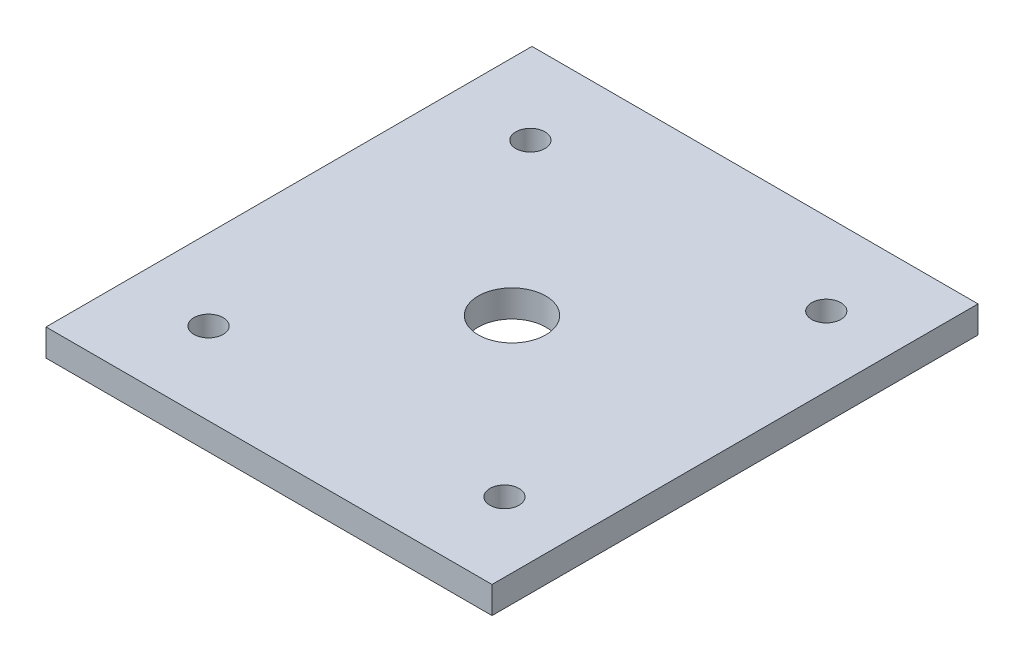
ISO-10303-21;
HEADER;
FILE_DESCRIPTION(('STEP AP214'),'2;1');
FILE_NAME('part.step','',(''),(''),'','','');
FILE_SCHEMA(('AUTOMOTIVE_DESIGN { 1 0 10303 214 1 1 1 1 }'));
ENDSEC;
DATA;
#1=APPLICATION_CONTEXT('core data for automotive mechanical design processes');
#2=APPLICATION_PROTOCOL_DEFINITION('international standard','automotive_design',2000,#1);
#3=PRODUCT_CONTEXT('',#1,'mechanical');
#4=PRODUCT('Part','Part','',(#3));
#5=PRODUCT_RELATED_PRODUCT_CATEGORY('part','',(#4));
#6=PRODUCT_DEFINITION_FORMATION('','',#4);
#7=PRODUCT_DEFINITION_CONTEXT('part definition',#1,'design');
#8=PRODUCT_DEFINITION('design','',#6,#7);
#9=PRODUCT_DEFINITION_SHAPE('','',#8);
#10=(LENGTH_UNIT() NAMED_UNIT(*) SI_UNIT(.MILLI.,.METRE.));
#11=(NAMED_UNIT(*) PLANE_ANGLE_UNIT() SI_UNIT($,.RADIAN.));
#12=(NAMED_UNIT(*) SI_UNIT($,.STERADIAN.) SOLID_ANGLE_UNIT());
#13=UNCERTAINTY_MEASURE_WITH_UNIT(LENGTH_MEASURE(1.E-05),#10,'distance_accuracy_value','');
#14=(GEOMETRIC_REPRESENTATION_CONTEXT(3) GLOBAL_UNCERTAINTY_ASSIGNED_CONTEXT((#13)) GLOBAL_UNIT_ASSIGNED_CONTEXT((#10,
#11,#12)) REPRESENTATION_CONTEXT('',''));
#15=CARTESIAN_POINT('',(0.,0.,0.));
#16=DIRECTION('',(0.,0.,1.));
#17=DIRECTION('',(1.,0.,0.));
#18=AXIS2_PLACEMENT_3D('',#15,#16,#17);
#19=CARTESIAN_POINT('',(52.451,6.35,-57.15));
#20=DIRECTION('',(-1.,0.,0.));
#21=DIRECTION('',(0.,0.,1.));
#22=AXIS2_PLACEMENT_3D('',#19,#20,#21);
#23=PLANE('',#22);
#24=DIRECTION('',(0.,0.,-1.));
#25=VECTOR('',#24,1.);
#26=CARTESIAN_POINT('',(52.451,0.,-57.15));
#27=LINE('',#26,#25);
#28=CARTESIAN_POINT('',(52.451,0.,57.15));
#29=VERTEX_POINT('',#28);
#30=CARTESIAN_POINT('',(52.451,0.,-57.15));
#31=VERTEX_POINT('',#30);
#32=EDGE_CURVE('E96',#29,#31,#27,.T.);
#33=ORIENTED_EDGE('',*,*,#32,.T.);
#34=DIRECTION('',(0.,-1.,0.));
#35=VECTOR('',#34,1.);
#36=CARTESIAN_POINT('',(52.451,6.35,-57.15));
#37=LINE('',#36,#35);
#38=CARTESIAN_POINT('',(52.451,6.35,-57.15));
#39=VERTEX_POINT('',#38);
#40=EDGE_CURVE('E11',#39,#31,#37,.T.);
#41=ORIENTED_EDGE('',*,*,#40,.F.);
#42=DIRECTION('',(0.,0.,-1.));
#43=VECTOR('',#42,1.);
#44=CARTESIAN_POINT('',(52.451,6.35,-57.15));
#45=LINE('',#44,#43);
#46=CARTESIAN_POINT('',(52.451,6.35,57.15));
#47=VERTEX_POINT('',#46);
#48=EDGE_CURVE('E84',#47,#39,#45,.T.);
#49=ORIENTED_EDGE('',*,*,#48,.F.);
#50=DIRECTION('',(0.,-1.,0.));
#51=VECTOR('',#50,1.);
#52=CARTESIAN_POINT('',(52.451,6.35,57.15));
#53=LINE('',#52,#51);
#54=EDGE_CURVE('E92',#47,#29,#53,.T.);
#55=ORIENTED_EDGE('',*,*,#54,.T.);
#56=EDGE_LOOP('',(#33,#41,#49,#55));
#57=FACE_BOUND('',#56,.T.);
#58=ADVANCED_FACE('F33',(#57),#23,.F.);
#59=CARTESIAN_POINT('',(-52.451,6.35,-57.15));
#60=DIRECTION('',(0.,0.,1.));
#61=DIRECTION('',(1.,0.,0.));
#62=AXIS2_PLACEMENT_3D('',#59,#60,#61);
#63=PLANE('',#62);
#64=DIRECTION('',(-1.,0.,0.));
#65=VECTOR('',#64,1.);
#66=CARTESIAN_POINT('',(-52.451,0.,-57.15));
#67=LINE('',#66,#65);
#68=CARTESIAN_POINT('',(-52.451,0.,-57.15));
#69=VERTEX_POINT('',#68);
#70=EDGE_CURVE('E88',#31,#69,#67,.T.);
#71=ORIENTED_EDGE('',*,*,#70,.T.);
#72=DIRECTION('',(0.,-1.,0.));
#73=VECTOR('',#72,1.);
#74=CARTESIAN_POINT('',(-52.451,6.35,-57.15));
#75=LINE('',#74,#73);
#76=CARTESIAN_POINT('',(-52.451,6.35,-57.15));
#77=VERTEX_POINT('',#76);
#78=EDGE_CURVE('E41',#77,#69,#75,.T.);
#79=ORIENTED_EDGE('',*,*,#78,.F.);
#80=DIRECTION('',(-1.,0.,0.));
#81=VECTOR('',#80,1.);
#82=CARTESIAN_POINT('',(-52.451,6.35,-57.15));
#83=LINE('',#82,#81);
#84=EDGE_CURVE('E79',#39,#77,#83,.T.);
#85=ORIENTED_EDGE('',*,*,#84,.F.);
#86=ORIENTED_EDGE('',*,*,#40,.T.);
#87=EDGE_LOOP('',(#71,#79,#85,#86));
#88=FACE_BOUND('',#87,.T.);
#89=ADVANCED_FACE('F87',(#88),#63,.F.);
#90=CARTESIAN_POINT('',(-52.451,6.35,-57.15));
#91=DIRECTION('',(1.,0.,0.));
#92=DIRECTION('',(0.,0.,-1.));
#93=AXIS2_PLACEMENT_3D('',#90,#91,#92);
#94=PLANE('',#93);
#95=DIRECTION('',(0.,0.,1.));
#96=VECTOR('',#95,1.);
#97=CARTESIAN_POINT('',(-52.451,0.,-57.15));
#98=LINE('',#97,#96);
#99=CARTESIAN_POINT('',(-52.451,0.,57.15));
#100=VERTEX_POINT('',#99);
#101=EDGE_CURVE('E66',#69,#100,#98,.T.);
#102=ORIENTED_EDGE('',*,*,#101,.T.);
#103=DIRECTION('',(0.,-1.,0.));
#104=VECTOR('',#103,1.);
#105=CARTESIAN_POINT('',(-52.451,6.35,57.15));
#106=LINE('',#105,#104);
#107=CARTESIAN_POINT('',(-52.451,6.35,57.15));
#108=VERTEX_POINT('',#107);
#109=EDGE_CURVE('E89',#108,#100,#106,.T.);
#110=ORIENTED_EDGE('',*,*,#109,.F.);
#111=DIRECTION('',(0.,0.,1.));
#112=VECTOR('',#111,1.);
#113=CARTESIAN_POINT('',(-52.451,6.35,-57.15));
#114=LINE('',#113,#112);
#115=EDGE_CURVE('E82',#77,#108,#114,.T.);
#116=ORIENTED_EDGE('',*,*,#115,.F.);
#117=ORIENTED_EDGE('',*,*,#78,.T.);
#118=EDGE_LOOP('',(#102,#110,#116,#117));
#119=FACE_BOUND('',#118,.T.);
#120=ADVANCED_FACE('F90',(#119),#94,.F.);
#121=CARTESIAN_POINT('',(-52.451,6.35,57.15));
#122=DIRECTION('',(0.,0.,-1.));
#123=DIRECTION('',(-1.,0.,0.));
#124=AXIS2_PLACEMENT_3D('',#121,#122,#123);
#125=PLANE('',#124);
#126=DIRECTION('',(1.,0.,0.));
#127=VECTOR('',#126,1.);
#128=CARTESIAN_POINT('',(-52.451,0.,57.15));
#129=LINE('',#128,#127);
#130=EDGE_CURVE('E72',#100,#29,#129,.T.);
#131=ORIENTED_EDGE('',*,*,#130,.T.);
#132=ORIENTED_EDGE('',*,*,#54,.F.);
#133=DIRECTION('',(1.,0.,0.));
#134=VECTOR('',#133,1.);
#135=CARTESIAN_POINT('',(-52.451,6.35,57.15));
#136=LINE('',#135,#134);
#137=EDGE_CURVE('E49',#108,#47,#136,.T.);
#138=ORIENTED_EDGE('',*,*,#137,.F.);
#139=ORIENTED_EDGE('',*,*,#109,.T.);
#140=EDGE_LOOP('',(#131,#132,#138,#139));
#141=FACE_BOUND('',#140,.T.);
#142=ADVANCED_FACE('F104',(#141),#125,.F.);
#143=CARTESIAN_POINT('',(0.,6.35,0.));
#144=DIRECTION('',(0.,1.,0.));
#145=DIRECTION('',(0.,0.,1.));
#146=AXIS2_PLACEMENT_3D('',#143,#144,#145);
#147=PLANE('',#146);
#148=CARTESIAN_POINT('',(0.,6.35,0.));
#149=DIRECTION('',(0.,1.,0.));
#150=DIRECTION('',(0.,0.,1.));
#151=AXIS2_PLACEMENT_3D('',#148,#149,#150);
#152=CIRCLE('',#151,7.9375);
#153=CARTESIAN_POINT('',(0.,6.35,7.9375));
#154=VERTEX_POINT('',#153);
#155=EDGE_CURVE('E134',#154,#154,#152,.F.);
#156=ORIENTED_EDGE('',*,*,#155,.T.);
#157=EDGE_LOOP('',(#156));
#158=FACE_BOUND('',#157,.T.);
#159=CARTESIAN_POINT('',(36.068,6.35,-37.846));
#160=DIRECTION('',(0.,1.,0.));
#161=DIRECTION('',(0.,0.,1.));
#162=AXIS2_PLACEMENT_3D('',#159,#160,#161);
#163=CIRCLE('',#162,3.42899999999999);
#164=CARTESIAN_POINT('',(36.068,6.35,-34.417));
#165=VERTEX_POINT('',#164);
#166=EDGE_CURVE('E128',#165,#165,#163,.F.);
#167=ORIENTED_EDGE('',*,*,#166,.T.);
#168=EDGE_LOOP('',(#167));
#169=FACE_BOUND('',#168,.T.);
#170=CARTESIAN_POINT('',(36.068,6.35,37.846));
#171=DIRECTION('',(0.,1.,0.));
#172=DIRECTION('',(0.,0.,1.));
#173=AXIS2_PLACEMENT_3D('',#170,#171,#172);
#174=CIRCLE('',#173,3.42899999999999);
#175=CARTESIAN_POINT('',(36.068,6.35,41.275));
#176=VERTEX_POINT('',#175);
#177=EDGE_CURVE('E122',#176,#176,#174,.F.);
#178=ORIENTED_EDGE('',*,*,#177,.T.);
#179=EDGE_LOOP('',(#178));
#180=FACE_BOUND('',#179,.T.);
#181=CARTESIAN_POINT('',(-33.528,6.35,-37.846));
#182=DIRECTION('',(0.,1.,0.));
#183=DIRECTION('',(0.,0.,1.));
#184=AXIS2_PLACEMENT_3D('',#181,#182,#183);
#185=CIRCLE('',#184,3.429);
#186=CARTESIAN_POINT('',(-33.528,6.35,-34.417));
#187=VERTEX_POINT('',#186);
#188=EDGE_CURVE('E116',#187,#187,#185,.F.);
#189=ORIENTED_EDGE('',*,*,#188,.T.);
#190=EDGE_LOOP('',(#189));
#191=FACE_BOUND('',#190,.T.);
#192=CARTESIAN_POINT('',(-33.528,6.35,37.846));
#193=DIRECTION('',(0.,1.,0.));
#194=DIRECTION('',(0.,0.,1.));
#195=AXIS2_PLACEMENT_3D('',#192,#193,#194);
#196=CIRCLE('',#195,3.429);
#197=CARTESIAN_POINT('',(-33.528,6.35,41.275));
#198=VERTEX_POINT('',#197);
#199=EDGE_CURVE('E110',#198,#198,#196,.F.);
#200=ORIENTED_EDGE('',*,*,#199,.T.);
#201=EDGE_LOOP('',(#200));
#202=FACE_BOUND('',#201,.T.);
#203=ORIENTED_EDGE('',*,*,#48,.T.);
#204=ORIENTED_EDGE('',*,*,#84,.T.);
#205=ORIENTED_EDGE('',*,*,#115,.T.);
#206=ORIENTED_EDGE('',*,*,#137,.T.);
#207=EDGE_LOOP('',(#203,#204,#205,#206));
#208=FACE_BOUND('',#207,.T.);
#209=ADVANCED_FACE('F80',(#158,#169,#180,#191,#202,#208),#147,.T.);
#210=CARTESIAN_POINT('',(0.,0.,0.));
#211=DIRECTION('',(0.,1.,0.));
#212=DIRECTION('',(0.,0.,1.));
#213=AXIS2_PLACEMENT_3D('',#210,#211,#212);
#214=PLANE('',#213);
#215=CARTESIAN_POINT('',(0.,0.,0.));
#216=DIRECTION('',(0.,-1.,0.));
#217=DIRECTION('',(0.,0.,-1.));
#218=AXIS2_PLACEMENT_3D('',#215,#216,#217);
#219=CIRCLE('',#218,7.9375);
#220=CARTESIAN_POINT('',(0.,0.,-7.9375));
#221=VERTEX_POINT('',#220);
#222=EDGE_CURVE('E131',#221,#221,#219,.T.);
#223=ORIENTED_EDGE('',*,*,#222,.F.);
#224=EDGE_LOOP('',(#223));
#225=FACE_BOUND('',#224,.T.);
#226=CARTESIAN_POINT('',(36.068,0.,-37.846));
#227=DIRECTION('',(0.,-1.,0.));
#228=DIRECTION('',(0.,0.,-1.));
#229=AXIS2_PLACEMENT_3D('',#226,#227,#228);
#230=CIRCLE('',#229,3.42899999999999);
#231=CARTESIAN_POINT('',(36.068,0.,-41.275));
#232=VERTEX_POINT('',#231);
#233=EDGE_CURVE('E125',#232,#232,#230,.T.);
#234=ORIENTED_EDGE('',*,*,#233,.F.);
#235=EDGE_LOOP('',(#234));
#236=FACE_BOUND('',#235,.T.);
#237=CARTESIAN_POINT('',(36.068,0.,37.846));
#238=DIRECTION('',(0.,-1.,0.));
#239=DIRECTION('',(0.,0.,1.));
#240=AXIS2_PLACEMENT_3D('',#237,#238,#239);
#241=CIRCLE('',#240,3.42899999999999);
#242=CARTESIAN_POINT('',(36.068,0.,41.275));
#243=VERTEX_POINT('',#242);
#244=EDGE_CURVE('E119',#243,#243,#241,.T.);
#245=ORIENTED_EDGE('',*,*,#244,.F.);
#246=EDGE_LOOP('',(#245));
#247=FACE_BOUND('',#246,.T.);
#248=CARTESIAN_POINT('',(-33.528,0.,-37.846));
#249=DIRECTION('',(0.,-1.,0.));
#250=DIRECTION('',(0.,0.,1.));
#251=AXIS2_PLACEMENT_3D('',#248,#249,#250);
#252=CIRCLE('',#251,3.429);
#253=CARTESIAN_POINT('',(-33.528,0.,-34.417));
#254=VERTEX_POINT('',#253);
#255=EDGE_CURVE('E113',#254,#254,#252,.T.);
#256=ORIENTED_EDGE('',*,*,#255,.F.);
#257=EDGE_LOOP('',(#256));
#258=FACE_BOUND('',#257,.T.);
#259=CARTESIAN_POINT('',(-33.528,0.,37.846));
#260=DIRECTION('',(0.,-1.,0.));
#261=DIRECTION('',(0.,0.,-1.));
#262=AXIS2_PLACEMENT_3D('',#259,#260,#261);
#263=CIRCLE('',#262,3.429);
#264=CARTESIAN_POINT('',(-33.528,0.,34.417));
#265=VERTEX_POINT('',#264);
#266=EDGE_CURVE('E99',#265,#265,#263,.T.);
#267=ORIENTED_EDGE('',*,*,#266,.F.);
#268=EDGE_LOOP('',(#267));
#269=FACE_BOUND('',#268,.T.);
#270=ORIENTED_EDGE('',*,*,#32,.F.);
#271=ORIENTED_EDGE('',*,*,#130,.F.);
#272=ORIENTED_EDGE('',*,*,#101,.F.);
#273=ORIENTED_EDGE('',*,*,#70,.F.);
#274=EDGE_LOOP('',(#270,#271,#272,#273));
#275=FACE_BOUND('',#274,.T.);
#276=ADVANCED_FACE('F107',(#225,#236,#247,#258,#269,#275),#214,.F.);
#277=CARTESIAN_POINT('',(-33.528,6.351,37.846));
#278=DIRECTION('',(0.,-1.,0.));
#279=DIRECTION('',(0.,0.,-1.));
#280=AXIS2_PLACEMENT_3D('',#277,#278,#279);
#281=CYLINDRICAL_SURFACE('',#280,3.429);
#282=ORIENTED_EDGE('',*,*,#199,.F.);
#283=EDGE_LOOP('',(#282));
#284=FACE_BOUND('',#283,.T.);
#285=ORIENTED_EDGE('',*,*,#266,.T.);
#286=EDGE_LOOP('',(#285));
#287=FACE_BOUND('',#286,.T.);
#288=ADVANCED_FACE('F144',(#284,#287),#281,.F.);
#289=CARTESIAN_POINT('',(-33.528,6.351,-37.846));
#290=DIRECTION('',(0.,-1.,0.));
#291=DIRECTION('',(0.,0.,-1.));
#292=AXIS2_PLACEMENT_3D('',#289,#290,#291);
#293=CYLINDRICAL_SURFACE('',#292,3.429);
#294=ORIENTED_EDGE('',*,*,#188,.F.);
#295=EDGE_LOOP('',(#294));
#296=FACE_BOUND('',#295,.T.);
#297=ORIENTED_EDGE('',*,*,#255,.T.);
#298=EDGE_LOOP('',(#297));
#299=FACE_BOUND('',#298,.T.);
#300=ADVANCED_FACE('F155',(#296,#299),#293,.F.);
#301=CARTESIAN_POINT('',(36.068,6.351,37.846));
#302=DIRECTION('',(0.,-1.,0.));
#303=DIRECTION('',(0.,0.,-1.));
#304=AXIS2_PLACEMENT_3D('',#301,#302,#303);
#305=CYLINDRICAL_SURFACE('',#304,3.42899999999999);
#306=ORIENTED_EDGE('',*,*,#177,.F.);
#307=EDGE_LOOP('',(#306));
#308=FACE_BOUND('',#307,.T.);
#309=ORIENTED_EDGE('',*,*,#244,.T.);
#310=EDGE_LOOP('',(#309));
#311=FACE_BOUND('',#310,.T.);
#312=ADVANCED_FACE('F161',(#308,#311),#305,.F.);
#313=CARTESIAN_POINT('',(36.068,6.351,-37.846));
#314=DIRECTION('',(0.,-1.,0.));
#315=DIRECTION('',(0.,0.,-1.));
#316=AXIS2_PLACEMENT_3D('',#313,#314,#315);
#317=CYLINDRICAL_SURFACE('',#316,3.42899999999999);
#318=ORIENTED_EDGE('',*,*,#166,.F.);
#319=EDGE_LOOP('',(#318));
#320=FACE_BOUND('',#319,.T.);
#321=ORIENTED_EDGE('',*,*,#233,.T.);
#322=EDGE_LOOP('',(#321));
#323=FACE_BOUND('',#322,.T.);
#324=ADVANCED_FACE('F192',(#320,#323),#317,.F.);
#325=CARTESIAN_POINT('',(0.,6.351,0.));
#326=DIRECTION('',(0.,-1.,0.));
#327=DIRECTION('',(0.,0.,-1.));
#328=AXIS2_PLACEMENT_3D('',#325,#326,#327);
#329=CYLINDRICAL_SURFACE('',#328,7.9375);
#330=ORIENTED_EDGE('',*,*,#155,.F.);
#331=EDGE_LOOP('',(#330));
#332=FACE_BOUND('',#331,.T.);
#333=ORIENTED_EDGE('',*,*,#222,.T.);
#334=EDGE_LOOP('',(#333));
#335=FACE_BOUND('',#334,.T.);
#336=ADVANCED_FACE('F140',(#332,#335),#329,.F.);
#337=CLOSED_SHELL('',(#58,#89,#120,#142,#209,#276,#288,#300,#312,#324,#336));
#338=MANIFOLD_SOLID_BREP('B2',#337);
#339=ADVANCED_BREP_SHAPE_REPRESENTATION('',(#18,#338),#14);
#340=SHAPE_DEFINITION_REPRESENTATION(#9,#339);
ENDSEC;
END-ISO-10303-21;
